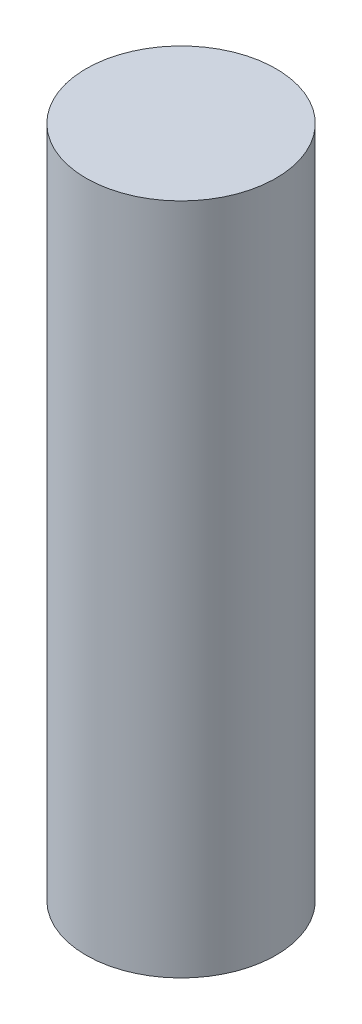
ISO-10303-21;
HEADER;
FILE_DESCRIPTION(('STEP AP214'),'2;1');
FILE_NAME('part.step','',(''),(''),'','','');
FILE_SCHEMA(('AUTOMOTIVE_DESIGN { 1 0 10303 214 1 1 1 1 }'));
ENDSEC;
DATA;
#1=APPLICATION_CONTEXT('core data for automotive mechanical design processes');
#2=APPLICATION_PROTOCOL_DEFINITION('international standard','automotive_design',2000,#1);
#3=PRODUCT_CONTEXT('',#1,'mechanical');
#4=PRODUCT('Part','Part','',(#3));
#5=PRODUCT_RELATED_PRODUCT_CATEGORY('part','',(#4));
#6=PRODUCT_DEFINITION_FORMATION('','',#4);
#7=PRODUCT_DEFINITION_CONTEXT('part definition',#1,'design');
#8=PRODUCT_DEFINITION('design','',#6,#7);
#9=PRODUCT_DEFINITION_SHAPE('','',#8);
#10=(LENGTH_UNIT() NAMED_UNIT(*) SI_UNIT(.MILLI.,.METRE.));
#11=(NAMED_UNIT(*) PLANE_ANGLE_UNIT() SI_UNIT($,.RADIAN.));
#12=(NAMED_UNIT(*) SI_UNIT($,.STERADIAN.) SOLID_ANGLE_UNIT());
#13=UNCERTAINTY_MEASURE_WITH_UNIT(LENGTH_MEASURE(1.E-05),#10,'distance_accuracy_value','');
#14=(GEOMETRIC_REPRESENTATION_CONTEXT(3) GLOBAL_UNCERTAINTY_ASSIGNED_CONTEXT((#13)) GLOBAL_UNIT_ASSIGNED_CONTEXT((#10,
#11,#12)) REPRESENTATION_CONTEXT('',''));
#15=CARTESIAN_POINT('',(0.,0.,0.));
#16=DIRECTION('',(0.,0.,1.));
#17=DIRECTION('',(1.,0.,0.));
#18=AXIS2_PLACEMENT_3D('',#15,#16,#17);
#19=CARTESIAN_POINT('',(0.,31.9,0.));
#20=DIRECTION('',(0.,-1.,0.));
#21=DIRECTION('',(0.,0.,-1.));
#22=AXIS2_PLACEMENT_3D('',#19,#20,#21);
#23=CYLINDRICAL_SURFACE('',#22,4.5);
#24=CARTESIAN_POINT('',(0.,31.9,0.));
#25=DIRECTION('',(0.,1.,0.));
#26=DIRECTION('',(0.,0.,1.));
#27=AXIS2_PLACEMENT_3D('',#24,#25,#26);
#28=CIRCLE('',#27,4.5);
#29=CARTESIAN_POINT('',(0.,31.9,4.5));
#30=VERTEX_POINT('',#29);
#31=EDGE_CURVE('E10',#30,#30,#28,.T.);
#32=ORIENTED_EDGE('',*,*,#31,.F.);
#33=EDGE_LOOP('',(#32));
#34=FACE_BOUND('',#33,.T.);
#35=CARTESIAN_POINT('',(0.,0.,0.));
#36=DIRECTION('',(0.,1.,0.));
#37=DIRECTION('',(0.,0.,1.));
#38=AXIS2_PLACEMENT_3D('',#35,#36,#37);
#39=CIRCLE('',#38,4.5);
#40=CARTESIAN_POINT('',(0.,0.,4.5));
#41=VERTEX_POINT('',#40);
#42=EDGE_CURVE('E42',#41,#41,#39,.T.);
#43=ORIENTED_EDGE('',*,*,#42,.T.);
#44=EDGE_LOOP('',(#43));
#45=FACE_BOUND('',#44,.T.);
#46=ADVANCED_FACE('F39',(#34,#45),#23,.T.);
#47=CARTESIAN_POINT('',(0.,31.9,0.));
#48=DIRECTION('',(0.,1.,0.));
#49=DIRECTION('',(0.,0.,1.));
#50=AXIS2_PLACEMENT_3D('',#47,#48,#49);
#51=PLANE('',#50);
#52=ORIENTED_EDGE('',*,*,#31,.T.);
#53=EDGE_LOOP('',(#52));
#54=FACE_BOUND('',#53,.T.);
#55=ADVANCED_FACE('F56',(#54),#51,.T.);
#56=CARTESIAN_POINT('',(0.,0.,0.));
#57=DIRECTION('',(0.,1.,0.));
#58=DIRECTION('',(0.,0.,1.));
#59=AXIS2_PLACEMENT_3D('',#56,#57,#58);
#60=PLANE('',#59);
#61=ORIENTED_EDGE('',*,*,#42,.F.);
#62=EDGE_LOOP('',(#61));
#63=FACE_BOUND('',#62,.T.);
#64=ADVANCED_FACE('F54',(#63),#60,.F.);
#65=CLOSED_SHELL('',(#46,#55,#64));
#66=MANIFOLD_SOLID_BREP('B2',#65);
#67=ADVANCED_BREP_SHAPE_REPRESENTATION('',(#18,#66),#14);
#68=SHAPE_DEFINITION_REPRESENTATION(#9,#67);
ENDSEC;
END-ISO-10303-21;
